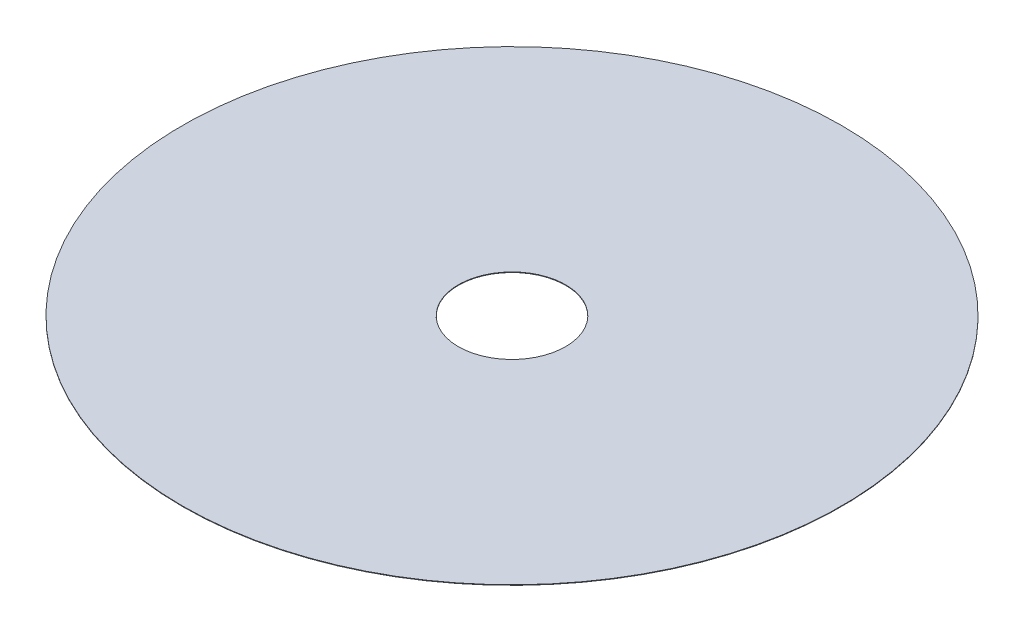
ISO-10303-21;
HEADER;
FILE_DESCRIPTION(('STEP AP214'),'2;1');
FILE_NAME('part.step','',(''),(''),'','','');
FILE_SCHEMA(('AUTOMOTIVE_DESIGN { 1 0 10303 214 1 1 1 1 }'));
ENDSEC;
DATA;
#1=APPLICATION_CONTEXT('core data for automotive mechanical design processes');
#2=APPLICATION_PROTOCOL_DEFINITION('international standard','automotive_design',2000,#1);
#3=PRODUCT_CONTEXT('',#1,'mechanical');
#4=PRODUCT('Part','Part','',(#3));
#5=PRODUCT_RELATED_PRODUCT_CATEGORY('part','',(#4));
#6=PRODUCT_DEFINITION_FORMATION('','',#4);
#7=PRODUCT_DEFINITION_CONTEXT('part definition',#1,'design');
#8=PRODUCT_DEFINITION('design','',#6,#7);
#9=PRODUCT_DEFINITION_SHAPE('','',#8);
#10=(LENGTH_UNIT() NAMED_UNIT(*) SI_UNIT(.MILLI.,.METRE.));
#11=(NAMED_UNIT(*) PLANE_ANGLE_UNIT() SI_UNIT($,.RADIAN.));
#12=(NAMED_UNIT(*) SI_UNIT($,.STERADIAN.) SOLID_ANGLE_UNIT());
#13=UNCERTAINTY_MEASURE_WITH_UNIT(LENGTH_MEASURE(1.E-05),#10,'distance_accuracy_value','');
#14=(GEOMETRIC_REPRESENTATION_CONTEXT(3) GLOBAL_UNCERTAINTY_ASSIGNED_CONTEXT((#13)) GLOBAL_UNIT_ASSIGNED_CONTEXT((#10,
#11,#12)) REPRESENTATION_CONTEXT('',''));
#15=CARTESIAN_POINT('',(0.,0.,0.));
#16=DIRECTION('',(0.,0.,1.));
#17=DIRECTION('',(1.,0.,0.));
#18=AXIS2_PLACEMENT_3D('',#15,#16,#17);
#19=CARTESIAN_POINT('',(0.,0.0388055555555556,0.));
#20=DIRECTION('',(0.,1.,0.));
#21=DIRECTION('',(0.,0.,1.));
#22=AXIS2_PLACEMENT_3D('',#19,#20,#21);
#23=PLANE('',#22);
#24=CARTESIAN_POINT('',(0.,0.0388055555555556,0.));
#25=DIRECTION('',(0.,1.,0.));
#26=DIRECTION('',(0.,0.,1.));
#27=AXIS2_PLACEMENT_3D('',#24,#25,#26);
#28=CIRCLE('',#27,24.534);
#29=CARTESIAN_POINT('',(0.,0.0388055555555556,24.534));
#30=VERTEX_POINT('',#29);
#31=EDGE_CURVE('E10',#30,#30,#28,.T.);
#32=ORIENTED_EDGE('',*,*,#31,.T.);
#33=EDGE_LOOP('',(#32));
#34=FACE_BOUND('',#33,.T.);
#35=CARTESIAN_POINT('',(0.,0.0388055555555556,0.));
#36=DIRECTION('',(0.,1.,0.));
#37=DIRECTION('',(0.,0.,1.));
#38=AXIS2_PLACEMENT_3D('',#35,#36,#37);
#39=CIRCLE('',#38,3.9925);
#40=CARTESIAN_POINT('',(0.,0.0388055555555556,3.9925));
#41=VERTEX_POINT('',#40);
#42=EDGE_CURVE('E43',#41,#41,#39,.T.);
#43=ORIENTED_EDGE('',*,*,#42,.F.);
#44=EDGE_LOOP('',(#43));
#45=FACE_BOUND('',#44,.T.);
#46=ADVANCED_FACE('F32',(#34,#45),#23,.T.);
#47=CARTESIAN_POINT('',(0.,0.,0.));
#48=DIRECTION('',(0.,1.,0.));
#49=DIRECTION('',(0.,0.,1.));
#50=AXIS2_PLACEMENT_3D('',#47,#48,#49);
#51=PLANE('',#50);
#52=CARTESIAN_POINT('',(0.,0.,0.));
#53=DIRECTION('',(0.,1.,0.));
#54=DIRECTION('',(0.,0.,1.));
#55=AXIS2_PLACEMENT_3D('',#52,#53,#54);
#56=CIRCLE('',#55,24.534);
#57=CARTESIAN_POINT('',(0.,0.,24.534));
#58=VERTEX_POINT('',#57);
#59=EDGE_CURVE('E36',#58,#58,#56,.T.);
#60=ORIENTED_EDGE('',*,*,#59,.F.);
#61=EDGE_LOOP('',(#60));
#62=FACE_BOUND('',#61,.T.);
#63=CARTESIAN_POINT('',(0.,0.,0.));
#64=DIRECTION('',(0.,1.,0.));
#65=DIRECTION('',(0.,0.,1.));
#66=AXIS2_PLACEMENT_3D('',#63,#64,#65);
#67=CIRCLE('',#66,3.9925);
#68=CARTESIAN_POINT('',(0.,0.,3.9925));
#69=VERTEX_POINT('',#68);
#70=EDGE_CURVE('E45',#69,#69,#67,.T.);
#71=ORIENTED_EDGE('',*,*,#70,.T.);
#72=EDGE_LOOP('',(#71));
#73=FACE_BOUND('',#72,.T.);
#74=ADVANCED_FACE('F55',(#62,#73),#51,.F.);
#75=CARTESIAN_POINT('',(0.,0.0388055555555556,0.));
#76=DIRECTION('',(0.,-1.,0.));
#77=DIRECTION('',(0.,0.,-1.));
#78=AXIS2_PLACEMENT_3D('',#75,#76,#77);
#79=CYLINDRICAL_SURFACE('',#78,24.534);
#80=ORIENTED_EDGE('',*,*,#31,.F.);
#81=EDGE_LOOP('',(#80));
#82=FACE_BOUND('',#81,.T.);
#83=ORIENTED_EDGE('',*,*,#59,.T.);
#84=EDGE_LOOP('',(#83));
#85=FACE_BOUND('',#84,.T.);
#86=ADVANCED_FACE('F34',(#82,#85),#79,.T.);
#87=CARTESIAN_POINT('',(0.,0.0388055555555556,0.));
#88=DIRECTION('',(0.,-1.,0.));
#89=DIRECTION('',(0.,0.,-1.));
#90=AXIS2_PLACEMENT_3D('',#87,#88,#89);
#91=CYLINDRICAL_SURFACE('',#90,3.9925);
#92=ORIENTED_EDGE('',*,*,#42,.T.);
#93=EDGE_LOOP('',(#92));
#94=FACE_BOUND('',#93,.T.);
#95=ORIENTED_EDGE('',*,*,#70,.F.);
#96=EDGE_LOOP('',(#95));
#97=FACE_BOUND('',#96,.T.);
#98=ADVANCED_FACE('F51',(#94,#97),#91,.F.);
#99=CLOSED_SHELL('',(#46,#74,#86,#98));
#100=MANIFOLD_SOLID_BREP('B2',#99);
#101=ADVANCED_BREP_SHAPE_REPRESENTATION('',(#18,#100),#14);
#102=SHAPE_DEFINITION_REPRESENTATION(#9,#101);
ENDSEC;
END-ISO-10303-21;
